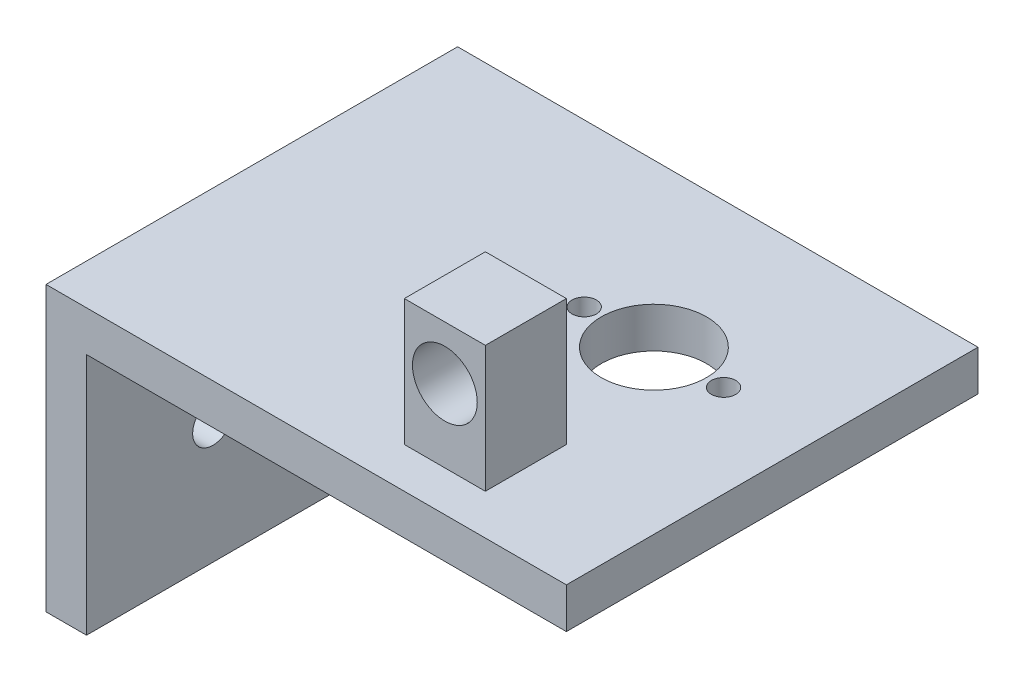
ISO-10303-21;
HEADER;
FILE_DESCRIPTION(('STEP AP214'),'2;1');
FILE_NAME('part.step','',(''),(''),'','','');
FILE_SCHEMA(('AUTOMOTIVE_DESIGN { 1 0 10303 214 1 1 1 1 }'));
ENDSEC;
DATA;
#1=APPLICATION_CONTEXT('core data for automotive mechanical design processes');
#2=APPLICATION_PROTOCOL_DEFINITION('international standard','automotive_design',2000,#1);
#3=PRODUCT_CONTEXT('',#1,'mechanical');
#4=PRODUCT('Part','Part','',(#3));
#5=PRODUCT_RELATED_PRODUCT_CATEGORY('part','',(#4));
#6=PRODUCT_DEFINITION_FORMATION('','',#4);
#7=PRODUCT_DEFINITION_CONTEXT('part definition',#1,'design');
#8=PRODUCT_DEFINITION('design','',#6,#7);
#9=PRODUCT_DEFINITION_SHAPE('','',#8);
#10=(LENGTH_UNIT() NAMED_UNIT(*) SI_UNIT(.MILLI.,.METRE.));
#11=(NAMED_UNIT(*) PLANE_ANGLE_UNIT() SI_UNIT($,.RADIAN.));
#12=(NAMED_UNIT(*) SI_UNIT($,.STERADIAN.) SOLID_ANGLE_UNIT());
#13=UNCERTAINTY_MEASURE_WITH_UNIT(LENGTH_MEASURE(1.E-05),#10,'distance_accuracy_value','');
#14=(GEOMETRIC_REPRESENTATION_CONTEXT(3) GLOBAL_UNCERTAINTY_ASSIGNED_CONTEXT((#13)) GLOBAL_UNIT_ASSIGNED_CONTEXT((#10,
#11,#12)) REPRESENTATION_CONTEXT('',''));
#15=CARTESIAN_POINT('',(0.,0.,0.));
#16=DIRECTION('',(0.,0.,1.));
#17=DIRECTION('',(1.,0.,0.));
#18=AXIS2_PLACEMENT_3D('',#15,#16,#17);
#19=CARTESIAN_POINT('',(0.,0.,0.));
#20=DIRECTION('',(0.,1.,0.));
#21=DIRECTION('',(0.,0.,1.));
#22=AXIS2_PLACEMENT_3D('',#19,#20,#21);
#23=PLANE('',#22);
#24=CARTESIAN_POINT('',(-8.6,0.,0.));
#25=DIRECTION('',(0.,1.,0.));
#26=DIRECTION('',(0.,0.,1.));
#27=AXIS2_PLACEMENT_3D('',#24,#25,#26);
#28=CIRCLE('',#27,1.5);
#29=CARTESIAN_POINT('',(-8.6,0.,1.5));
#30=VERTEX_POINT('',#29);
#31=EDGE_CURVE('E220',#30,#30,#28,.F.);
#32=ORIENTED_EDGE('',*,*,#31,.F.);
#33=EDGE_LOOP('',(#32));
#34=FACE_BOUND('',#33,.T.);
#35=CARTESIAN_POINT('',(8.6,0.,0.));
#36=DIRECTION('',(0.,1.,0.));
#37=DIRECTION('',(0.,0.,1.));
#38=AXIS2_PLACEMENT_3D('',#35,#36,#37);
#39=CIRCLE('',#38,1.5);
#40=CARTESIAN_POINT('',(8.6,0.,1.5));
#41=VERTEX_POINT('',#40);
#42=EDGE_CURVE('E221',#41,#41,#39,.F.);
#43=ORIENTED_EDGE('',*,*,#42,.F.);
#44=EDGE_LOOP('',(#43));
#45=FACE_BOUND('',#44,.T.);
#46=CARTESIAN_POINT('',(0.,0.,0.));
#47=DIRECTION('',(0.,1.,0.));
#48=DIRECTION('',(0.,0.,1.));
#49=AXIS2_PLACEMENT_3D('',#46,#47,#48);
#50=CIRCLE('',#49,6.5);
#51=CARTESIAN_POINT('',(0.,0.,6.5));
#52=VERTEX_POINT('',#51);
#53=EDGE_CURVE('E214',#52,#52,#50,.F.);
#54=ORIENTED_EDGE('',*,*,#53,.F.);
#55=EDGE_LOOP('',(#54));
#56=FACE_BOUND('',#55,.T.);
#57=DIRECTION('',(0.,0.,1.));
#58=VECTOR('',#57,1.);
#59=CARTESIAN_POINT('',(-39.225,0.,-20.));
#60=LINE('',#59,#58);
#61=CARTESIAN_POINT('',(-39.225,0.,-20.));
#62=VERTEX_POINT('',#61);
#63=CARTESIAN_POINT('',(-39.225,0.,30.8));
#64=VERTEX_POINT('',#63);
#65=EDGE_CURVE('E47',#62,#64,#60,.T.);
#66=ORIENTED_EDGE('',*,*,#65,.F.);
#67=DIRECTION('',(-1.,0.,0.));
#68=VECTOR('',#67,1.);
#69=CARTESIAN_POINT('',(-20.,0.,-20.));
#70=LINE('',#69,#68);
#71=CARTESIAN_POINT('',(20.,0.,-20.));
#72=VERTEX_POINT('',#71);
#73=EDGE_CURVE('E134',#72,#62,#70,.T.);
#74=ORIENTED_EDGE('',*,*,#73,.F.);
#75=DIRECTION('',(0.,0.,-1.));
#76=VECTOR('',#75,1.);
#77=CARTESIAN_POINT('',(20.,0.,-20.));
#78=LINE('',#77,#76);
#79=CARTESIAN_POINT('',(20.,0.,30.8));
#80=VERTEX_POINT('',#79);
#81=EDGE_CURVE('E188',#80,#72,#78,.T.);
#82=ORIENTED_EDGE('',*,*,#81,.F.);
#83=DIRECTION('',(1.,0.,0.));
#84=VECTOR('',#83,1.);
#85=CARTESIAN_POINT('',(-20.,0.,30.8));
#86=LINE('',#85,#84);
#87=EDGE_CURVE('E180',#64,#80,#86,.T.);
#88=ORIENTED_EDGE('',*,*,#87,.F.);
#89=EDGE_LOOP('',(#66,#74,#82,#88));
#90=FACE_BOUND('',#89,.T.);
#91=ADVANCED_FACE('F32',(#34,#45,#56,#90),#23,.F.);
#92=CARTESIAN_POINT('',(0.,5.,0.));
#93=DIRECTION('',(0.,1.,0.));
#94=DIRECTION('',(0.,0.,1.));
#95=AXIS2_PLACEMENT_3D('',#92,#93,#94);
#96=PLANE('',#95);
#97=CARTESIAN_POINT('',(-8.6,5.,0.));
#98=DIRECTION('',(0.,1.,0.));
#99=DIRECTION('',(0.,0.,1.));
#100=AXIS2_PLACEMENT_3D('',#97,#98,#99);
#101=CIRCLE('',#100,1.5);
#102=CARTESIAN_POINT('',(-8.6,5.,1.5));
#103=VERTEX_POINT('',#102);
#104=EDGE_CURVE('E224',#103,#103,#101,.T.);
#105=ORIENTED_EDGE('',*,*,#104,.F.);
#106=EDGE_LOOP('',(#105));
#107=FACE_BOUND('',#106,.T.);
#108=CARTESIAN_POINT('',(8.6,5.,0.));
#109=DIRECTION('',(0.,1.,0.));
#110=DIRECTION('',(0.,0.,1.));
#111=AXIS2_PLACEMENT_3D('',#108,#109,#110);
#112=CIRCLE('',#111,1.5);
#113=CARTESIAN_POINT('',(8.6,5.,1.5));
#114=VERTEX_POINT('',#113);
#115=EDGE_CURVE('E225',#114,#114,#112,.T.);
#116=ORIENTED_EDGE('',*,*,#115,.F.);
#117=EDGE_LOOP('',(#116));
#118=FACE_BOUND('',#117,.T.);
#119=CARTESIAN_POINT('',(0.,5.,0.));
#120=DIRECTION('',(0.,1.,0.));
#121=DIRECTION('',(0.,0.,1.));
#122=AXIS2_PLACEMENT_3D('',#119,#120,#121);
#123=CIRCLE('',#122,6.5);
#124=CARTESIAN_POINT('',(0.,5.,6.5));
#125=VERTEX_POINT('',#124);
#126=EDGE_CURVE('E217',#125,#125,#123,.T.);
#127=ORIENTED_EDGE('',*,*,#126,.F.);
#128=EDGE_LOOP('',(#127));
#129=FACE_BOUND('',#128,.T.);
#130=DIRECTION('',(-1.,0.,0.));
#131=VECTOR('',#130,1.);
#132=CARTESIAN_POINT('',(-20.,5.,-20.));
#133=LINE('',#132,#131);
#134=CARTESIAN_POINT('',(20.,5.,-20.));
#135=VERTEX_POINT('',#134);
#136=CARTESIAN_POINT('',(-44.225,5.,-20.));
#137=VERTEX_POINT('',#136);
#138=EDGE_CURVE('E185',#135,#137,#133,.T.);
#139=ORIENTED_EDGE('',*,*,#138,.T.);
#140=DIRECTION('',(0.,0.,-1.));
#141=VECTOR('',#140,1.);
#142=CARTESIAN_POINT('',(-44.225,5.,30.8));
#143=LINE('',#142,#141);
#144=CARTESIAN_POINT('',(-44.225,5.,30.8));
#145=VERTEX_POINT('',#144);
#146=EDGE_CURVE('E138',#145,#137,#143,.T.);
#147=ORIENTED_EDGE('',*,*,#146,.F.);
#148=DIRECTION('',(1.,0.,0.));
#149=VECTOR('',#148,1.);
#150=CARTESIAN_POINT('',(-20.,5.,30.8));
#151=LINE('',#150,#149);
#152=CARTESIAN_POINT('',(20.,5.,30.8));
#153=VERTEX_POINT('',#152);
#154=EDGE_CURVE('E181',#145,#153,#151,.T.);
#155=ORIENTED_EDGE('',*,*,#154,.T.);
#156=DIRECTION('',(0.,0.,-1.));
#157=VECTOR('',#156,1.);
#158=CARTESIAN_POINT('',(20.,5.,-20.));
#159=LINE('',#158,#157);
#160=EDGE_CURVE('E183',#153,#135,#159,.T.);
#161=ORIENTED_EDGE('',*,*,#160,.T.);
#162=EDGE_LOOP('',(#139,#147,#155,#161));
#163=FACE_BOUND('',#162,.T.);
#164=DIRECTION('',(-1.,0.,0.));
#165=VECTOR('',#164,1.);
#166=CARTESIAN_POINT('',(5.,5.,15.8));
#167=LINE('',#166,#165);
#168=CARTESIAN_POINT('',(5.,5.,15.8));
#169=VERTEX_POINT('',#168);
#170=CARTESIAN_POINT('',(-5.,5.,15.8));
#171=VERTEX_POINT('',#170);
#172=EDGE_CURVE('E167',#169,#171,#167,.T.);
#173=ORIENTED_EDGE('',*,*,#172,.F.);
#174=DIRECTION('',(0.,0.,-1.));
#175=VECTOR('',#174,1.);
#176=CARTESIAN_POINT('',(5.,5.,15.8));
#177=LINE('',#176,#175);
#178=CARTESIAN_POINT('',(5.,5.,25.8));
#179=VERTEX_POINT('',#178);
#180=EDGE_CURVE('E151',#179,#169,#177,.T.);
#181=ORIENTED_EDGE('',*,*,#180,.F.);
#182=DIRECTION('',(1.,0.,0.));
#183=VECTOR('',#182,1.);
#184=CARTESIAN_POINT('',(5.,5.,25.8));
#185=LINE('',#184,#183);
#186=CARTESIAN_POINT('',(-5.,5.,25.8));
#187=VERTEX_POINT('',#186);
#188=EDGE_CURVE('E158',#187,#179,#185,.T.);
#189=ORIENTED_EDGE('',*,*,#188,.F.);
#190=DIRECTION('',(0.,0.,1.));
#191=VECTOR('',#190,1.);
#192=CARTESIAN_POINT('',(-5.,5.,15.8));
#193=LINE('',#192,#191);
#194=EDGE_CURVE('E169',#171,#187,#193,.T.);
#195=ORIENTED_EDGE('',*,*,#194,.F.);
#196=EDGE_LOOP('',(#173,#181,#189,#195));
#197=FACE_BOUND('',#196,.T.);
#198=ADVANCED_FACE('F235',(#107,#118,#129,#163,#197),#96,.T.);
#199=CARTESIAN_POINT('',(-20.,5.,30.8));
#200=DIRECTION('',(0.,0.,-1.));
#201=DIRECTION('',(-1.,0.,0.));
#202=AXIS2_PLACEMENT_3D('',#199,#200,#201);
#203=PLANE('',#202);
#204=DIRECTION('',(0.,1.,0.));
#205=VECTOR('',#204,1.);
#206=CARTESIAN_POINT('',(-44.225,0.,30.8));
#207=LINE('',#206,#205);
#208=CARTESIAN_POINT('',(-44.225,-30.,30.8));
#209=VERTEX_POINT('',#208);
#210=EDGE_CURVE('E135',#209,#145,#207,.T.);
#211=ORIENTED_EDGE('',*,*,#210,.F.);
#212=DIRECTION('',(1.,0.,0.));
#213=VECTOR('',#212,1.);
#214=CARTESIAN_POINT('',(-44.225,-30.,30.8));
#215=LINE('',#214,#213);
#216=CARTESIAN_POINT('',(-39.225,-30.,30.8));
#217=VERTEX_POINT('',#216);
#218=EDGE_CURVE('E121',#209,#217,#215,.T.);
#219=ORIENTED_EDGE('',*,*,#218,.T.);
#220=DIRECTION('',(0.,1.,0.));
#221=VECTOR('',#220,1.);
#222=CARTESIAN_POINT('',(-39.225,-30.,30.8));
#223=LINE('',#222,#221);
#224=EDGE_CURVE('E117',#217,#64,#223,.T.);
#225=ORIENTED_EDGE('',*,*,#224,.T.);
#226=ORIENTED_EDGE('',*,*,#87,.T.);
#227=DIRECTION('',(0.,-1.,0.));
#228=VECTOR('',#227,1.);
#229=CARTESIAN_POINT('',(20.,5.,30.8));
#230=LINE('',#229,#228);
#231=EDGE_CURVE('E11',#153,#80,#230,.T.);
#232=ORIENTED_EDGE('',*,*,#231,.F.);
#233=ORIENTED_EDGE('',*,*,#154,.F.);
#234=EDGE_LOOP('',(#211,#219,#225,#226,#232,#233));
#235=FACE_BOUND('',#234,.T.);
#236=ADVANCED_FACE('F34',(#235),#203,.F.);
#237=CARTESIAN_POINT('',(20.,5.,-20.));
#238=DIRECTION('',(-1.,0.,0.));
#239=DIRECTION('',(0.,0.,1.));
#240=AXIS2_PLACEMENT_3D('',#237,#238,#239);
#241=PLANE('',#240);
#242=ORIENTED_EDGE('',*,*,#81,.T.);
#243=DIRECTION('',(0.,-1.,0.));
#244=VECTOR('',#243,1.);
#245=CARTESIAN_POINT('',(20.,5.,-20.));
#246=LINE('',#245,#244);
#247=EDGE_CURVE('E40',#135,#72,#246,.T.);
#248=ORIENTED_EDGE('',*,*,#247,.F.);
#249=ORIENTED_EDGE('',*,*,#160,.F.);
#250=ORIENTED_EDGE('',*,*,#231,.T.);
#251=EDGE_LOOP('',(#242,#248,#249,#250));
#252=FACE_BOUND('',#251,.T.);
#253=ADVANCED_FACE('F195',(#252),#241,.F.);
#254=CARTESIAN_POINT('',(-20.,5.,-20.));
#255=DIRECTION('',(0.,0.,1.));
#256=DIRECTION('',(1.,0.,0.));
#257=AXIS2_PLACEMENT_3D('',#254,#255,#256);
#258=PLANE('',#257);
#259=ORIENTED_EDGE('',*,*,#73,.T.);
#260=DIRECTION('',(0.,1.,0.));
#261=VECTOR('',#260,1.);
#262=CARTESIAN_POINT('',(-39.225,-30.,-20.));
#263=LINE('',#262,#261);
#264=CARTESIAN_POINT('',(-39.225,-30.,-20.));
#265=VERTEX_POINT('',#264);
#266=EDGE_CURVE('E115',#265,#62,#263,.T.);
#267=ORIENTED_EDGE('',*,*,#266,.F.);
#268=DIRECTION('',(1.,0.,0.));
#269=VECTOR('',#268,1.);
#270=CARTESIAN_POINT('',(-44.225,-30.,-20.));
#271=LINE('',#270,#269);
#272=CARTESIAN_POINT('',(-44.225,-30.,-20.));
#273=VERTEX_POINT('',#272);
#274=EDGE_CURVE('E122',#273,#265,#271,.T.);
#275=ORIENTED_EDGE('',*,*,#274,.F.);
#276=DIRECTION('',(0.,-1.,0.));
#277=VECTOR('',#276,1.);
#278=CARTESIAN_POINT('',(-44.225,0.,-20.));
#279=LINE('',#278,#277);
#280=EDGE_CURVE('E145',#137,#273,#279,.T.);
#281=ORIENTED_EDGE('',*,*,#280,.F.);
#282=ORIENTED_EDGE('',*,*,#138,.F.);
#283=ORIENTED_EDGE('',*,*,#247,.T.);
#284=EDGE_LOOP('',(#259,#267,#275,#281,#282,#283));
#285=FACE_BOUND('',#284,.T.);
#286=ADVANCED_FACE('F132',(#285),#258,.F.);
#287=CARTESIAN_POINT('',(5.,20.6,15.8));
#288=DIRECTION('',(-1.,0.,0.));
#289=DIRECTION('',(0.,0.,1.));
#290=AXIS2_PLACEMENT_3D('',#287,#288,#289);
#291=PLANE('',#290);
#292=ORIENTED_EDGE('',*,*,#180,.T.);
#293=DIRECTION('',(0.,-1.,0.));
#294=VECTOR('',#293,1.);
#295=CARTESIAN_POINT('',(5.,20.6,15.8));
#296=LINE('',#295,#294);
#297=CARTESIAN_POINT('',(5.,20.6,15.8));
#298=VERTEX_POINT('',#297);
#299=EDGE_CURVE('E178',#298,#169,#296,.T.);
#300=ORIENTED_EDGE('',*,*,#299,.F.);
#301=DIRECTION('',(0.,0.,-1.));
#302=VECTOR('',#301,1.);
#303=CARTESIAN_POINT('',(5.,20.6,15.8));
#304=LINE('',#303,#302);
#305=CARTESIAN_POINT('',(5.,20.6,25.8));
#306=VERTEX_POINT('',#305);
#307=EDGE_CURVE('E154',#306,#298,#304,.T.);
#308=ORIENTED_EDGE('',*,*,#307,.F.);
#309=DIRECTION('',(0.,-1.,0.));
#310=VECTOR('',#309,1.);
#311=CARTESIAN_POINT('',(5.,20.6,25.8));
#312=LINE('',#311,#310);
#313=EDGE_CURVE('E164',#306,#179,#312,.T.);
#314=ORIENTED_EDGE('',*,*,#313,.T.);
#315=EDGE_LOOP('',(#292,#300,#308,#314));
#316=FACE_BOUND('',#315,.T.);
#317=ADVANCED_FACE('F260',(#316),#291,.F.);
#318=CARTESIAN_POINT('',(5.,20.6,15.8));
#319=DIRECTION('',(0.,0.,1.));
#320=DIRECTION('',(1.,0.,0.));
#321=AXIS2_PLACEMENT_3D('',#318,#319,#320);
#322=PLANE('',#321);
#323=ORIENTED_EDGE('',*,*,#172,.T.);
#324=DIRECTION('',(0.,-1.,0.));
#325=VECTOR('',#324,1.);
#326=CARTESIAN_POINT('',(-5.,20.6,15.8));
#327=LINE('',#326,#325);
#328=CARTESIAN_POINT('',(-5.,20.6,15.8));
#329=VERTEX_POINT('',#328);
#330=EDGE_CURVE('E175',#329,#171,#327,.T.);
#331=ORIENTED_EDGE('',*,*,#330,.F.);
#332=DIRECTION('',(-1.,0.,0.));
#333=VECTOR('',#332,1.);
#334=CARTESIAN_POINT('',(5.,20.6,15.8));
#335=LINE('',#334,#333);
#336=EDGE_CURVE('E157',#298,#329,#335,.T.);
#337=ORIENTED_EDGE('',*,*,#336,.F.);
#338=ORIENTED_EDGE('',*,*,#299,.T.);
#339=EDGE_LOOP('',(#323,#331,#337,#338));
#340=FACE_BOUND('',#339,.T.);
#341=ADVANCED_FACE('F250',(#340),#322,.F.);
#342=CARTESIAN_POINT('',(-5.,20.6,15.8));
#343=DIRECTION('',(1.,0.,0.));
#344=DIRECTION('',(0.,0.,-1.));
#345=AXIS2_PLACEMENT_3D('',#342,#343,#344);
#346=PLANE('',#345);
#347=ORIENTED_EDGE('',*,*,#194,.T.);
#348=DIRECTION('',(0.,-1.,0.));
#349=VECTOR('',#348,1.);
#350=CARTESIAN_POINT('',(-5.,20.6,25.8));
#351=LINE('',#350,#349);
#352=CARTESIAN_POINT('',(-5.,20.6,25.8));
#353=VERTEX_POINT('',#352);
#354=EDGE_CURVE('E55',#353,#187,#351,.T.);
#355=ORIENTED_EDGE('',*,*,#354,.F.);
#356=DIRECTION('',(0.,0.,1.));
#357=VECTOR('',#356,1.);
#358=CARTESIAN_POINT('',(-5.,20.6,15.8));
#359=LINE('',#358,#357);
#360=EDGE_CURVE('E160',#329,#353,#359,.T.);
#361=ORIENTED_EDGE('',*,*,#360,.F.);
#362=ORIENTED_EDGE('',*,*,#330,.T.);
#363=EDGE_LOOP('',(#347,#355,#361,#362));
#364=FACE_BOUND('',#363,.T.);
#365=ADVANCED_FACE('F254',(#364),#346,.F.);
#366=CARTESIAN_POINT('',(5.,20.6,25.8));
#367=DIRECTION('',(0.,0.,-1.));
#368=DIRECTION('',(-1.,0.,0.));
#369=AXIS2_PLACEMENT_3D('',#366,#367,#368);
#370=PLANE('',#369);
#371=CARTESIAN_POINT('',(0.,14.,25.8));
#372=DIRECTION('',(0.,0.,1.));
#373=DIRECTION('',(1.,0.,0.));
#374=AXIS2_PLACEMENT_3D('',#371,#372,#373);
#375=CIRCLE('',#374,4.);
#376=CARTESIAN_POINT('',(4.00000000000001,14.,25.8));
#377=VERTEX_POINT('',#376);
#378=EDGE_CURVE('E147',#377,#377,#375,.T.);
#379=ORIENTED_EDGE('',*,*,#378,.F.);
#380=EDGE_LOOP('',(#379));
#381=FACE_BOUND('',#380,.T.);
#382=ORIENTED_EDGE('',*,*,#188,.T.);
#383=ORIENTED_EDGE('',*,*,#313,.F.);
#384=DIRECTION('',(1.,0.,0.));
#385=VECTOR('',#384,1.);
#386=CARTESIAN_POINT('',(5.,20.6,25.8));
#387=LINE('',#386,#385);
#388=EDGE_CURVE('E162',#353,#306,#387,.T.);
#389=ORIENTED_EDGE('',*,*,#388,.F.);
#390=ORIENTED_EDGE('',*,*,#354,.T.);
#391=EDGE_LOOP('',(#382,#383,#389,#390));
#392=FACE_BOUND('',#391,.T.);
#393=ADVANCED_FACE('F261',(#381,#392),#370,.F.);
#394=CARTESIAN_POINT('',(0.,20.6,0.));
#395=DIRECTION('',(0.,-1.,0.));
#396=DIRECTION('',(0.,0.,-1.));
#397=AXIS2_PLACEMENT_3D('',#394,#395,#396);
#398=PLANE('',#397);
#399=ORIENTED_EDGE('',*,*,#307,.T.);
#400=ORIENTED_EDGE('',*,*,#336,.T.);
#401=ORIENTED_EDGE('',*,*,#360,.T.);
#402=ORIENTED_EDGE('',*,*,#388,.T.);
#403=EDGE_LOOP('',(#399,#400,#401,#402));
#404=FACE_BOUND('',#403,.T.);
#405=ADVANCED_FACE('F256',(#404),#398,.F.);
#406=CARTESIAN_POINT('',(0.,14.,17.8));
#407=DIRECTION('',(0.,0.,1.));
#408=DIRECTION('',(1.,0.,0.));
#409=AXIS2_PLACEMENT_3D('',#406,#407,#408);
#410=CYLINDRICAL_SURFACE('',#409,4.);
#411=CARTESIAN_POINT('',(0.,14.,17.8));
#412=DIRECTION('',(0.,0.,1.));
#413=DIRECTION('',(1.,0.,0.));
#414=AXIS2_PLACEMENT_3D('',#411,#412,#413);
#415=CIRCLE('',#414,4.);
#416=CARTESIAN_POINT('',(4.00000000000001,14.,17.8));
#417=VERTEX_POINT('',#416);
#418=EDGE_CURVE('E148',#417,#417,#415,.T.);
#419=ORIENTED_EDGE('',*,*,#418,.F.);
#420=EDGE_LOOP('',(#419));
#421=FACE_BOUND('',#420,.T.);
#422=ORIENTED_EDGE('',*,*,#378,.T.);
#423=EDGE_LOOP('',(#422));
#424=FACE_BOUND('',#423,.T.);
#425=ADVANCED_FACE('F269',(#421,#424),#410,.F.);
#426=CARTESIAN_POINT('',(0.,14.,17.8));
#427=DIRECTION('',(0.,0.,1.));
#428=DIRECTION('',(1.,0.,0.));
#429=AXIS2_PLACEMENT_3D('',#426,#427,#428);
#430=PLANE('',#429);
#431=ORIENTED_EDGE('',*,*,#418,.T.);
#432=EDGE_LOOP('',(#431));
#433=FACE_BOUND('',#432,.T.);
#434=ADVANCED_FACE('F352',(#433),#430,.T.);
#435=CARTESIAN_POINT('',(-44.225,0.,0.));
#436=DIRECTION('',(-1.,0.,0.));
#437=DIRECTION('',(0.,0.,1.));
#438=AXIS2_PLACEMENT_3D('',#435,#436,#437);
#439=PLANE('',#438);
#440=CARTESIAN_POINT('',(-44.225,-15.,15.2));
#441=DIRECTION('',(-1.,0.,0.));
#442=DIRECTION('',(0.,0.,1.));
#443=AXIS2_PLACEMENT_3D('',#440,#441,#442);
#444=CIRCLE('',#443,2.5);
#445=CARTESIAN_POINT('',(-44.225,-15.,17.7));
#446=VERTEX_POINT('',#445);
#447=EDGE_CURVE('E211',#446,#446,#444,.T.);
#448=ORIENTED_EDGE('',*,*,#447,.F.);
#449=EDGE_LOOP('',(#448));
#450=FACE_BOUND('',#449,.T.);
#451=CARTESIAN_POINT('',(-44.225,-15.,-4.8));
#452=DIRECTION('',(-1.,0.,0.));
#453=DIRECTION('',(0.,0.,1.));
#454=AXIS2_PLACEMENT_3D('',#451,#452,#453);
#455=CIRCLE('',#454,2.5);
#456=CARTESIAN_POINT('',(-44.225,-15.,-2.3));
#457=VERTEX_POINT('',#456);
#458=EDGE_CURVE('E201',#457,#457,#455,.T.);
#459=ORIENTED_EDGE('',*,*,#458,.F.);
#460=EDGE_LOOP('',(#459));
#461=FACE_BOUND('',#460,.T.);
#462=ORIENTED_EDGE('',*,*,#210,.T.);
#463=ORIENTED_EDGE('',*,*,#146,.T.);
#464=ORIENTED_EDGE('',*,*,#280,.T.);
#465=DIRECTION('',(0.,0.,1.));
#466=VECTOR('',#465,1.);
#467=CARTESIAN_POINT('',(-44.225,-30.,-20.));
#468=LINE('',#467,#466);
#469=EDGE_CURVE('E128',#273,#209,#468,.T.);
#470=ORIENTED_EDGE('',*,*,#469,.T.);
#471=EDGE_LOOP('',(#462,#463,#464,#470));
#472=FACE_BOUND('',#471,.T.);
#473=ADVANCED_FACE('F348',(#450,#461,#472),#439,.T.);
#474=CARTESIAN_POINT('',(-39.225,-30.,-20.));
#475=DIRECTION('',(-1.,0.,0.));
#476=DIRECTION('',(0.,0.,1.));
#477=AXIS2_PLACEMENT_3D('',#474,#475,#476);
#478=PLANE('',#477);
#479=CARTESIAN_POINT('',(-39.225,-15.,15.2));
#480=DIRECTION('',(-1.,0.,0.));
#481=DIRECTION('',(0.,0.,1.));
#482=AXIS2_PLACEMENT_3D('',#479,#480,#481);
#483=CIRCLE('',#482,2.5);
#484=CARTESIAN_POINT('',(-39.225,-15.,17.7));
#485=VERTEX_POINT('',#484);
#486=EDGE_CURVE('E208',#485,#485,#483,.F.);
#487=ORIENTED_EDGE('',*,*,#486,.F.);
#488=EDGE_LOOP('',(#487));
#489=FACE_BOUND('',#488,.T.);
#490=CARTESIAN_POINT('',(-39.225,-15.,-4.8));
#491=DIRECTION('',(-1.,0.,0.));
#492=DIRECTION('',(0.,0.,1.));
#493=AXIS2_PLACEMENT_3D('',#490,#491,#492);
#494=CIRCLE('',#493,2.5);
#495=CARTESIAN_POINT('',(-39.225,-15.,-2.3));
#496=VERTEX_POINT('',#495);
#497=EDGE_CURVE('E199',#496,#496,#494,.F.);
#498=ORIENTED_EDGE('',*,*,#497,.F.);
#499=EDGE_LOOP('',(#498));
#500=FACE_BOUND('',#499,.T.);
#501=ORIENTED_EDGE('',*,*,#65,.T.);
#502=ORIENTED_EDGE('',*,*,#224,.F.);
#503=DIRECTION('',(0.,0.,1.));
#504=VECTOR('',#503,1.);
#505=CARTESIAN_POINT('',(-39.225,-30.,-20.));
#506=LINE('',#505,#504);
#507=EDGE_CURVE('E111',#265,#217,#506,.T.);
#508=ORIENTED_EDGE('',*,*,#507,.F.);
#509=ORIENTED_EDGE('',*,*,#266,.T.);
#510=EDGE_LOOP('',(#501,#502,#508,#509));
#511=FACE_BOUND('',#510,.T.);
#512=ADVANCED_FACE('F113',(#489,#500,#511),#478,.F.);
#513=CARTESIAN_POINT('',(0.,-30.,0.));
#514=DIRECTION('',(0.,-1.,0.));
#515=DIRECTION('',(0.,0.,-1.));
#516=AXIS2_PLACEMENT_3D('',#513,#514,#515);
#517=PLANE('',#516);
#518=ORIENTED_EDGE('',*,*,#274,.T.);
#519=ORIENTED_EDGE('',*,*,#507,.T.);
#520=ORIENTED_EDGE('',*,*,#218,.F.);
#521=ORIENTED_EDGE('',*,*,#469,.F.);
#522=EDGE_LOOP('',(#518,#519,#520,#521));
#523=FACE_BOUND('',#522,.T.);
#524=ADVANCED_FACE('F126',(#523),#517,.T.);
#525=CARTESIAN_POINT('',(-32.1539321881345,-15.,-4.8));
#526=DIRECTION('',(-1.,0.,0.));
#527=DIRECTION('',(0.,0.,1.));
#528=AXIS2_PLACEMENT_3D('',#525,#526,#527);
#529=CYLINDRICAL_SURFACE('',#528,2.5);
#530=ORIENTED_EDGE('',*,*,#497,.T.);
#531=EDGE_LOOP('',(#530));
#532=FACE_BOUND('',#531,.T.);
#533=ORIENTED_EDGE('',*,*,#458,.T.);
#534=EDGE_LOOP('',(#533));
#535=FACE_BOUND('',#534,.T.);
#536=ADVANCED_FACE('F339',(#532,#535),#529,.F.);
#537=CARTESIAN_POINT('',(-32.1539321881345,-15.,15.2));
#538=DIRECTION('',(-1.,0.,0.));
#539=DIRECTION('',(0.,0.,1.));
#540=AXIS2_PLACEMENT_3D('',#537,#538,#539);
#541=CYLINDRICAL_SURFACE('',#540,2.5);
#542=ORIENTED_EDGE('',*,*,#486,.T.);
#543=EDGE_LOOP('',(#542));
#544=FACE_BOUND('',#543,.T.);
#545=ORIENTED_EDGE('',*,*,#447,.T.);
#546=EDGE_LOOP('',(#545));
#547=FACE_BOUND('',#546,.T.);
#548=ADVANCED_FACE('F312',(#544,#547),#541,.F.);
#549=CARTESIAN_POINT('',(0.,-18.3847763108502,0.));
#550=DIRECTION('',(0.,1.,0.));
#551=DIRECTION('',(0.,0.,1.));
#552=AXIS2_PLACEMENT_3D('',#549,#550,#551);
#553=CYLINDRICAL_SURFACE('',#552,6.5);
#554=ORIENTED_EDGE('',*,*,#53,.T.);
#555=EDGE_LOOP('',(#554));
#556=FACE_BOUND('',#555,.T.);
#557=ORIENTED_EDGE('',*,*,#126,.T.);
#558=EDGE_LOOP('',(#557));
#559=FACE_BOUND('',#558,.T.);
#560=ADVANCED_FACE('F306',(#556,#559),#553,.F.);
#561=CARTESIAN_POINT('',(8.6,-18.3847763108502,0.));
#562=DIRECTION('',(0.,1.,0.));
#563=DIRECTION('',(0.,0.,1.));
#564=AXIS2_PLACEMENT_3D('',#561,#562,#563);
#565=CYLINDRICAL_SURFACE('',#564,1.5);
#566=ORIENTED_EDGE('',*,*,#42,.T.);
#567=EDGE_LOOP('',(#566));
#568=FACE_BOUND('',#567,.T.);
#569=ORIENTED_EDGE('',*,*,#115,.T.);
#570=EDGE_LOOP('',(#569));
#571=FACE_BOUND('',#570,.T.);
#572=ADVANCED_FACE('F311',(#568,#571),#565,.F.);
#573=CARTESIAN_POINT('',(-8.6,-18.3847763108502,0.));
#574=DIRECTION('',(0.,1.,0.));
#575=DIRECTION('',(0.,0.,1.));
#576=AXIS2_PLACEMENT_3D('',#573,#574,#575);
#577=CYLINDRICAL_SURFACE('',#576,1.5);
#578=ORIENTED_EDGE('',*,*,#31,.T.);
#579=EDGE_LOOP('',(#578));
#580=FACE_BOUND('',#579,.T.);
#581=ORIENTED_EDGE('',*,*,#104,.T.);
#582=EDGE_LOOP('',(#581));
#583=FACE_BOUND('',#582,.T.);
#584=ADVANCED_FACE('F233',(#580,#583),#577,.F.);
#585=CLOSED_SHELL('',(#91,#198,#236,#253,#286,#317,#341,#365,#393,#405,#425,#434,#473,#512,#524,
#536,#548,#560,#572,#584));
#586=MANIFOLD_SOLID_BREP('B2',#585);
#587=ADVANCED_BREP_SHAPE_REPRESENTATION('',(#18,#586),#14);
#588=SHAPE_DEFINITION_REPRESENTATION(#9,#587);
ENDSEC;
END-ISO-10303-21;
